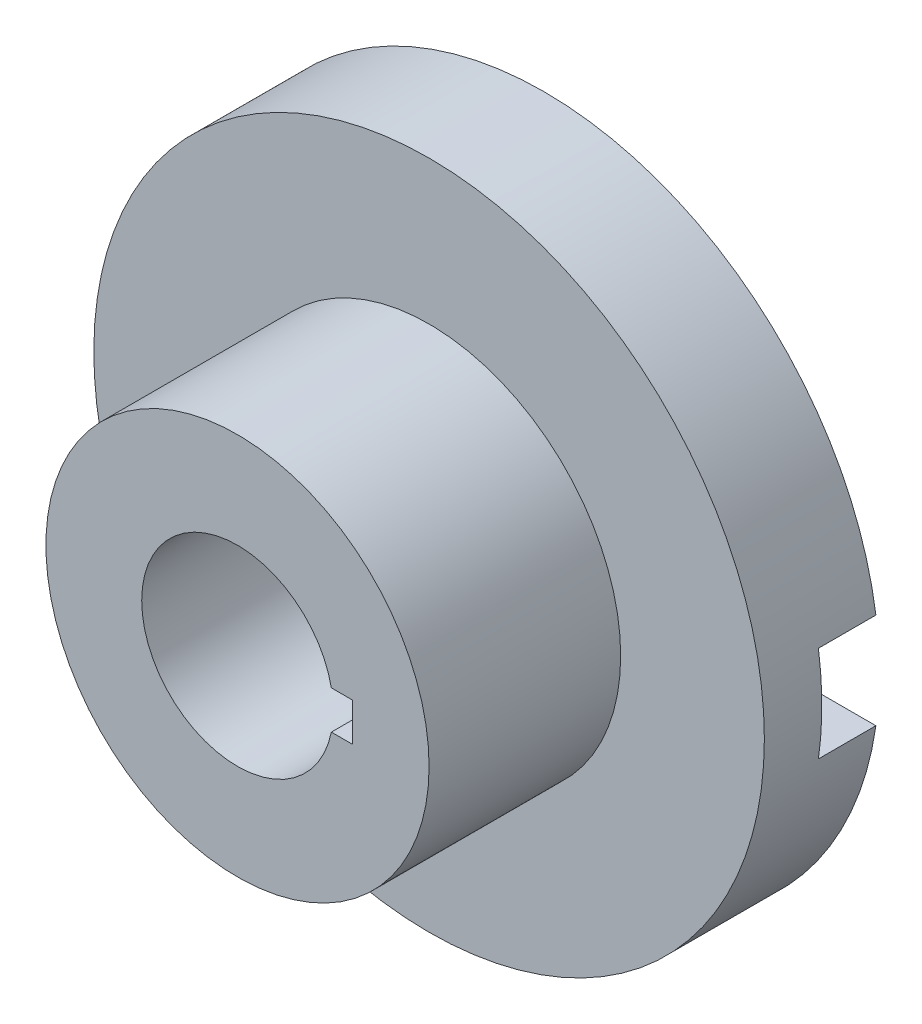
ISO-10303-21;
HEADER;
FILE_DESCRIPTION(('STEP AP214'),'2;1');
FILE_NAME('part.step','',(''),(''),'','','');
FILE_SCHEMA(('AUTOMOTIVE_DESIGN { 1 0 10303 214 1 1 1 1 }'));
ENDSEC;
DATA;
#1=APPLICATION_CONTEXT('core data for automotive mechanical design processes');
#2=APPLICATION_PROTOCOL_DEFINITION('international standard','automotive_design',2000,#1);
#3=PRODUCT_CONTEXT('',#1,'mechanical');
#4=PRODUCT('Part','Part','',(#3));
#5=PRODUCT_RELATED_PRODUCT_CATEGORY('part','',(#4));
#6=PRODUCT_DEFINITION_FORMATION('','',#4);
#7=PRODUCT_DEFINITION_CONTEXT('part definition',#1,'design');
#8=PRODUCT_DEFINITION('design','',#6,#7);
#9=PRODUCT_DEFINITION_SHAPE('','',#8);
#10=(LENGTH_UNIT() NAMED_UNIT(*) SI_UNIT(.MILLI.,.METRE.));
#11=(NAMED_UNIT(*) PLANE_ANGLE_UNIT() SI_UNIT($,.RADIAN.));
#12=(NAMED_UNIT(*) SI_UNIT($,.STERADIAN.) SOLID_ANGLE_UNIT());
#13=UNCERTAINTY_MEASURE_WITH_UNIT(LENGTH_MEASURE(1.E-05),#10,'distance_accuracy_value','');
#14=(GEOMETRIC_REPRESENTATION_CONTEXT(3) GLOBAL_UNCERTAINTY_ASSIGNED_CONTEXT((#13)) GLOBAL_UNIT_ASSIGNED_CONTEXT((#10,
#11,#12)) REPRESENTATION_CONTEXT('',''));
#15=CARTESIAN_POINT('',(0.,0.,0.));
#16=DIRECTION('',(0.,0.,1.));
#17=DIRECTION('',(1.,0.,0.));
#18=AXIS2_PLACEMENT_3D('',#15,#16,#17);
#19=CARTESIAN_POINT('',(173.205080756889,25.,30.));
#20=DIRECTION('',(0.,-1.,0.));
#21=DIRECTION('',(1.,0.,0.));
#22=AXIS2_PLACEMENT_3D('',#19,#20,#21);
#23=PLANE('',#22);
#24=DIRECTION('',(0.,0.,1.));
#25=VECTOR('',#24,1.);
#26=CARTESIAN_POINT('',(43.3012701892223,25.,0.));
#27=LINE('',#26,#25);
#28=CARTESIAN_POINT('',(43.3012701892223,25.,0.));
#29=VERTEX_POINT('',#28);
#30=CARTESIAN_POINT('',(43.3012701892223,25.,30.));
#31=VERTEX_POINT('',#30);
#32=EDGE_CURVE('E177',#29,#31,#27,.T.);
#33=ORIENTED_EDGE('',*,*,#32,.F.);
#34=DIRECTION('',(-1.,0.,0.));
#35=VECTOR('',#34,1.);
#36=CARTESIAN_POINT('',(173.205080756889,25.,0.));
#37=LINE('',#36,#35);
#38=CARTESIAN_POINT('',(173.205080756889,25.,0.));
#39=VERTEX_POINT('',#38);
#40=EDGE_CURVE('E207',#39,#29,#37,.T.);
#41=ORIENTED_EDGE('',*,*,#40,.F.);
#42=DIRECTION('',(0.,0.,-1.));
#43=VECTOR('',#42,1.);
#44=CARTESIAN_POINT('',(173.205080756889,25.,30.));
#45=LINE('',#44,#43);
#46=CARTESIAN_POINT('',(173.205080756889,25.,30.));
#47=VERTEX_POINT('',#46);
#48=EDGE_CURVE('E230',#47,#39,#45,.T.);
#49=ORIENTED_EDGE('',*,*,#48,.F.);
#50=DIRECTION('',(-1.,0.,0.));
#51=VECTOR('',#50,1.);
#52=CARTESIAN_POINT('',(173.205080756889,25.,30.));
#53=LINE('',#52,#51);
#54=EDGE_CURVE('E191',#47,#31,#53,.T.);
#55=ORIENTED_EDGE('',*,*,#54,.T.);
#56=EDGE_LOOP('',(#33,#41,#49,#55));
#57=FACE_BOUND('',#56,.T.);
#58=ADVANCED_FACE('F43',(#57),#23,.T.);
#59=CARTESIAN_POINT('',(173.205080756889,-25.,30.));
#60=DIRECTION('',(0.,-1.,0.));
#61=DIRECTION('',(1.,0.,0.));
#62=AXIS2_PLACEMENT_3D('',#59,#60,#61);
#63=PLANE('',#62);
#64=DIRECTION('',(-1.,0.,0.));
#65=VECTOR('',#64,1.);
#66=CARTESIAN_POINT('',(173.205080756889,-25.,0.));
#67=LINE('',#66,#65);
#68=CARTESIAN_POINT('',(173.205080756889,-25.,0.));
#69=VERTEX_POINT('',#68);
#70=CARTESIAN_POINT('',(43.3012701892223,-25.,0.));
#71=VERTEX_POINT('',#70);
#72=EDGE_CURVE('E195',#69,#71,#67,.T.);
#73=ORIENTED_EDGE('',*,*,#72,.T.);
#74=DIRECTION('',(0.,0.,1.));
#75=VECTOR('',#74,1.);
#76=CARTESIAN_POINT('',(43.3012701892223,-25.,0.));
#77=LINE('',#76,#75);
#78=CARTESIAN_POINT('',(43.3012701892223,-25.,30.));
#79=VERTEX_POINT('',#78);
#80=EDGE_CURVE('E166',#71,#79,#77,.T.);
#81=ORIENTED_EDGE('',*,*,#80,.T.);
#82=DIRECTION('',(-1.,0.,0.));
#83=VECTOR('',#82,1.);
#84=CARTESIAN_POINT('',(173.205080756889,-25.,30.));
#85=LINE('',#84,#83);
#86=CARTESIAN_POINT('',(173.205080756889,-25.,30.));
#87=VERTEX_POINT('',#86);
#88=EDGE_CURVE('E204',#87,#79,#85,.T.);
#89=ORIENTED_EDGE('',*,*,#88,.F.);
#90=DIRECTION('',(0.,0.,-1.));
#91=VECTOR('',#90,1.);
#92=CARTESIAN_POINT('',(173.205080756889,-25.,30.));
#93=LINE('',#92,#91);
#94=EDGE_CURVE('E208',#87,#69,#93,.T.);
#95=ORIENTED_EDGE('',*,*,#94,.T.);
#96=EDGE_LOOP('',(#73,#81,#89,#95));
#97=FACE_BOUND('',#96,.T.);
#98=ADVANCED_FACE('F320',(#97),#63,.F.);
#99=CARTESIAN_POINT('',(0.,0.,30.));
#100=DIRECTION('',(0.,0.,1.));
#101=DIRECTION('',(1.,0.,0.));
#102=AXIS2_PLACEMENT_3D('',#99,#100,#101);
#103=PLANE('',#102);
#104=CARTESIAN_POINT('',(-43.3012701892219,24.9999999999999,30.));
#105=VERTEX_POINT('',#104);
#106=CARTESIAN_POINT('',(-173.205080756888,24.9999999999999,30.));
#107=VERTEX_POINT('',#106);
#108=EDGE_CURVE('E192',#105,#107,#53,.T.);
#109=ORIENTED_EDGE('',*,*,#108,.F.);
#110=CARTESIAN_POINT('',(0.,0.,30.));
#111=DIRECTION('',(0.,0.,1.));
#112=DIRECTION('',(1.,0.,0.));
#113=AXIS2_PLACEMENT_3D('',#110,#111,#112);
#114=CIRCLE('',#113,50.);
#115=CARTESIAN_POINT('',(-43.3012701892219,-25.,30.));
#116=VERTEX_POINT('',#115);
#117=EDGE_CURVE('E11',#105,#116,#114,.T.);
#118=ORIENTED_EDGE('',*,*,#117,.T.);
#119=CARTESIAN_POINT('',(-173.205080756888,-25.,30.));
#120=VERTEX_POINT('',#119);
#121=EDGE_CURVE('E201',#116,#120,#85,.T.);
#122=ORIENTED_EDGE('',*,*,#121,.T.);
#123=CARTESIAN_POINT('',(0.,0.,30.));
#124=DIRECTION('',(0.,0.,1.));
#125=DIRECTION('',(1.,0.,0.));
#126=AXIS2_PLACEMENT_3D('',#123,#124,#125);
#127=CIRCLE('',#126,175.);
#128=EDGE_CURVE('E200',#107,#120,#127,.T.);
#129=ORIENTED_EDGE('',*,*,#128,.F.);
#130=EDGE_LOOP('',(#109,#118,#122,#129));
#131=FACE_BOUND('',#130,.T.);
#132=ADVANCED_FACE('F281',(#131),#103,.F.);
#133=CARTESIAN_POINT('',(0.,0.,0.));
#134=DIRECTION('',(0.,0.,1.));
#135=DIRECTION('',(1.,0.,0.));
#136=AXIS2_PLACEMENT_3D('',#133,#134,#135);
#137=PLANE('',#136);
#138=CARTESIAN_POINT('',(-43.3012701892219,-25.,0.));
#139=VERTEX_POINT('',#138);
#140=CARTESIAN_POINT('',(-173.205080756888,-25.,0.));
#141=VERTEX_POINT('',#140);
#142=EDGE_CURVE('E213',#139,#141,#67,.T.);
#143=ORIENTED_EDGE('',*,*,#142,.F.);
#144=CARTESIAN_POINT('',(0.,0.,0.));
#145=DIRECTION('',(0.,0.,1.));
#146=DIRECTION('',(1.,0.,0.));
#147=AXIS2_PLACEMENT_3D('',#144,#145,#146);
#148=CIRCLE('',#147,50.);
#149=EDGE_CURVE('E165',#139,#71,#148,.T.);
#150=ORIENTED_EDGE('',*,*,#149,.T.);
#151=ORIENTED_EDGE('',*,*,#72,.F.);
#152=CARTESIAN_POINT('',(0.,0.,0.));
#153=DIRECTION('',(0.,0.,1.));
#154=DIRECTION('',(1.,0.,0.));
#155=AXIS2_PLACEMENT_3D('',#152,#153,#154);
#156=CIRCLE('',#155,175.);
#157=EDGE_CURVE('E231',#141,#69,#156,.T.);
#158=ORIENTED_EDGE('',*,*,#157,.F.);
#159=EDGE_LOOP('',(#143,#150,#151,#158));
#160=FACE_BOUND('',#159,.T.);
#161=ADVANCED_FACE('F312',(#160),#137,.F.);
#162=CARTESIAN_POINT('',(0.,0.,60.0000000000001));
#163=DIRECTION('',(0.,0.,-1.));
#164=DIRECTION('',(-1.,0.,0.));
#165=AXIS2_PLACEMENT_3D('',#162,#163,#164);
#166=CYLINDRICAL_SURFACE('',#165,175.);
#167=CARTESIAN_POINT('',(0.,0.,30.));
#168=DIRECTION('',(0.,0.,1.));
#169=DIRECTION('',(1.,0.,0.));
#170=AXIS2_PLACEMENT_3D('',#167,#168,#169);
#171=CIRCLE('',#170,175.);
#172=EDGE_CURVE('E186',#87,#47,#171,.T.);
#173=ORIENTED_EDGE('',*,*,#172,.T.);
#174=ORIENTED_EDGE('',*,*,#48,.T.);
#175=CARTESIAN_POINT('',(-173.205080756888,24.9999999999999,0.));
#176=VERTEX_POINT('',#175);
#177=EDGE_CURVE('E241',#39,#176,#156,.T.);
#178=ORIENTED_EDGE('',*,*,#177,.T.);
#179=DIRECTION('',(0.,0.,-1.));
#180=VECTOR('',#179,1.);
#181=CARTESIAN_POINT('',(-173.205080756888,24.9999999999999,30.));
#182=LINE('',#181,#180);
#183=EDGE_CURVE('E224',#107,#176,#182,.T.);
#184=ORIENTED_EDGE('',*,*,#183,.F.);
#185=ORIENTED_EDGE('',*,*,#128,.T.);
#186=DIRECTION('',(0.,0.,-1.));
#187=VECTOR('',#186,1.);
#188=CARTESIAN_POINT('',(-173.205080756888,-25.,30.));
#189=LINE('',#188,#187);
#190=EDGE_CURVE('E218',#120,#141,#189,.T.);
#191=ORIENTED_EDGE('',*,*,#190,.T.);
#192=ORIENTED_EDGE('',*,*,#157,.T.);
#193=ORIENTED_EDGE('',*,*,#94,.F.);
#194=EDGE_LOOP('',(#173,#174,#178,#184,#185,#191,#192,#193));
#195=FACE_BOUND('',#194,.T.);
#196=CARTESIAN_POINT('',(0.,0.,60.0000000000001));
#197=DIRECTION('',(0.,0.,1.));
#198=DIRECTION('',(1.,0.,0.));
#199=AXIS2_PLACEMENT_3D('',#196,#197,#198);
#200=CIRCLE('',#199,175.);
#201=CARTESIAN_POINT('',(175.,0.,60.0000000000001));
#202=VERTEX_POINT('',#201);
#203=EDGE_CURVE('E238',#202,#202,#200,.T.);
#204=ORIENTED_EDGE('',*,*,#203,.F.);
#205=EDGE_LOOP('',(#204));
#206=FACE_BOUND('',#205,.T.);
#207=ADVANCED_FACE('F44',(#195,#206),#166,.T.);
#208=CARTESIAN_POINT('',(0.,0.,60.0000000000001));
#209=DIRECTION('',(0.,0.,1.));
#210=DIRECTION('',(1.,0.,0.));
#211=AXIS2_PLACEMENT_3D('',#208,#209,#210);
#212=PLANE('',#211);
#213=CARTESIAN_POINT('',(0.,0.,60.0000000000001));
#214=DIRECTION('',(0.,0.,1.));
#215=DIRECTION('',(1.,0.,0.));
#216=AXIS2_PLACEMENT_3D('',#213,#214,#215);
#217=CIRCLE('',#216,100.);
#218=CARTESIAN_POINT('',(100.,0.,60.0000000000001));
#219=VERTEX_POINT('',#218);
#220=EDGE_CURVE('E237',#219,#219,#217,.T.);
#221=ORIENTED_EDGE('',*,*,#220,.F.);
#222=EDGE_LOOP('',(#221));
#223=FACE_BOUND('',#222,.T.);
#224=ORIENTED_EDGE('',*,*,#203,.T.);
#225=EDGE_LOOP('',(#224));
#226=FACE_BOUND('',#225,.T.);
#227=ADVANCED_FACE('F363',(#223,#226),#212,.T.);
#228=ORIENTED_EDGE('',*,*,#40,.T.);
#229=CARTESIAN_POINT('',(-43.3012701892219,24.9999999999999,0.));
#230=VERTEX_POINT('',#229);
#231=EDGE_CURVE('E171',#29,#230,#148,.T.);
#232=ORIENTED_EDGE('',*,*,#231,.T.);
#233=EDGE_CURVE('E189',#230,#176,#37,.T.);
#234=ORIENTED_EDGE('',*,*,#233,.T.);
#235=ORIENTED_EDGE('',*,*,#177,.F.);
#236=EDGE_LOOP('',(#228,#232,#234,#235));
#237=FACE_BOUND('',#236,.T.);
#238=ADVANCED_FACE('F271',(#237),#137,.F.);
#239=CARTESIAN_POINT('',(0.,0.,160.));
#240=DIRECTION('',(0.,0.,-1.));
#241=DIRECTION('',(-1.,0.,0.));
#242=AXIS2_PLACEMENT_3D('',#239,#240,#241);
#243=CYLINDRICAL_SURFACE('',#242,100.);
#244=CARTESIAN_POINT('',(0.,0.,160.));
#245=DIRECTION('',(0.,0.,1.));
#246=DIRECTION('',(1.,0.,0.));
#247=AXIS2_PLACEMENT_3D('',#244,#245,#246);
#248=CIRCLE('',#247,100.);
#249=CARTESIAN_POINT('',(100.,0.,160.));
#250=VERTEX_POINT('',#249);
#251=EDGE_CURVE('E233',#250,#250,#248,.T.);
#252=ORIENTED_EDGE('',*,*,#251,.F.);
#253=EDGE_LOOP('',(#252));
#254=FACE_BOUND('',#253,.T.);
#255=ORIENTED_EDGE('',*,*,#220,.T.);
#256=EDGE_LOOP('',(#255));
#257=FACE_BOUND('',#256,.T.);
#258=ADVANCED_FACE('F353',(#254,#257),#243,.T.);
#259=CARTESIAN_POINT('',(0.,0.,160.));
#260=DIRECTION('',(0.,0.,1.));
#261=DIRECTION('',(1.,0.,0.));
#262=AXIS2_PLACEMENT_3D('',#259,#260,#261);
#263=PLANE('',#262);
#264=DIRECTION('',(-1.,0.,0.));
#265=VECTOR('',#264,1.);
#266=CARTESIAN_POINT('',(59.9997948556635,10.,160.));
#267=LINE('',#266,#265);
#268=CARTESIAN_POINT('',(59.9997948556635,10.,160.));
#269=VERTEX_POINT('',#268);
#270=CARTESIAN_POINT('',(48.9897948556638,10.,160.));
#271=VERTEX_POINT('',#270);
#272=EDGE_CURVE('E65',#269,#271,#267,.T.);
#273=ORIENTED_EDGE('',*,*,#272,.F.);
#274=DIRECTION('',(0.,1.,0.));
#275=VECTOR('',#274,1.);
#276=CARTESIAN_POINT('',(59.9997948556635,10.,160.));
#277=LINE('',#276,#275);
#278=CARTESIAN_POINT('',(59.9997948556635,-10.,160.));
#279=VERTEX_POINT('',#278);
#280=EDGE_CURVE('E160',#279,#269,#277,.T.);
#281=ORIENTED_EDGE('',*,*,#280,.F.);
#282=DIRECTION('',(1.,0.,0.));
#283=VECTOR('',#282,1.);
#284=CARTESIAN_POINT('',(59.9997948556635,-10.,160.));
#285=LINE('',#284,#283);
#286=CARTESIAN_POINT('',(48.9897948556638,-10.,160.));
#287=VERTEX_POINT('',#286);
#288=EDGE_CURVE('E140',#287,#279,#285,.T.);
#289=ORIENTED_EDGE('',*,*,#288,.F.);
#290=CARTESIAN_POINT('',(0.,0.,160.));
#291=DIRECTION('',(0.,0.,1.));
#292=DIRECTION('',(1.,0.,0.));
#293=AXIS2_PLACEMENT_3D('',#290,#291,#292);
#294=CIRCLE('',#293,50.);
#295=EDGE_CURVE('E149',#271,#287,#294,.T.);
#296=ORIENTED_EDGE('',*,*,#295,.F.);
#297=EDGE_LOOP('',(#273,#281,#289,#296));
#298=FACE_BOUND('',#297,.T.);
#299=ORIENTED_EDGE('',*,*,#251,.T.);
#300=EDGE_LOOP('',(#299));
#301=FACE_BOUND('',#300,.T.);
#302=ADVANCED_FACE('F152',(#298,#301),#263,.T.);
#303=DIRECTION('',(0.,0.,1.));
#304=VECTOR('',#303,1.);
#305=CARTESIAN_POINT('',(-43.3012701892219,24.9999999999999,0.));
#306=LINE('',#305,#304);
#307=EDGE_CURVE('E183',#105,#230,#306,.F.);
#308=ORIENTED_EDGE('',*,*,#307,.F.);
#309=ORIENTED_EDGE('',*,*,#108,.T.);
#310=ORIENTED_EDGE('',*,*,#183,.T.);
#311=ORIENTED_EDGE('',*,*,#233,.F.);
#312=EDGE_LOOP('',(#308,#309,#310,#311));
#313=FACE_BOUND('',#312,.T.);
#314=ADVANCED_FACE('F280',(#313),#23,.T.);
#315=ORIENTED_EDGE('',*,*,#121,.F.);
#316=DIRECTION('',(0.,0.,1.));
#317=VECTOR('',#316,1.);
#318=CARTESIAN_POINT('',(-43.3012701892219,-25.,0.));
#319=LINE('',#318,#317);
#320=EDGE_CURVE('E182',#116,#139,#319,.F.);
#321=ORIENTED_EDGE('',*,*,#320,.T.);
#322=ORIENTED_EDGE('',*,*,#142,.T.);
#323=ORIENTED_EDGE('',*,*,#190,.F.);
#324=EDGE_LOOP('',(#315,#321,#322,#323));
#325=FACE_BOUND('',#324,.T.);
#326=ADVANCED_FACE('F287',(#325),#63,.F.);
#327=DIRECTION('',(-1.,0.,0.));
#328=VECTOR('',#327,1.);
#329=CARTESIAN_POINT('',(0.,10.,30.));
#330=LINE('',#329,#328);
#331=CARTESIAN_POINT('',(59.9997948556635,10.,30.));
#332=VERTEX_POINT('',#331);
#333=CARTESIAN_POINT('',(48.9897948556638,10.,30.));
#334=VERTEX_POINT('',#333);
#335=EDGE_CURVE('E50',#332,#334,#330,.T.);
#336=ORIENTED_EDGE('',*,*,#335,.T.);
#337=EDGE_CURVE('E52',#334,#31,#114,.T.);
#338=ORIENTED_EDGE('',*,*,#337,.T.);
#339=ORIENTED_EDGE('',*,*,#54,.F.);
#340=ORIENTED_EDGE('',*,*,#172,.F.);
#341=ORIENTED_EDGE('',*,*,#88,.T.);
#342=CARTESIAN_POINT('',(48.9897948556638,-10.,30.));
#343=VERTEX_POINT('',#342);
#344=EDGE_CURVE('E54',#79,#343,#114,.T.);
#345=ORIENTED_EDGE('',*,*,#344,.T.);
#346=DIRECTION('',(1.,0.,0.));
#347=VECTOR('',#346,1.);
#348=CARTESIAN_POINT('',(0.,-10.,30.));
#349=LINE('',#348,#347);
#350=CARTESIAN_POINT('',(59.9997948556635,-10.,30.));
#351=VERTEX_POINT('',#350);
#352=EDGE_CURVE('E142',#343,#351,#349,.T.);
#353=ORIENTED_EDGE('',*,*,#352,.T.);
#354=DIRECTION('',(0.,1.,0.));
#355=VECTOR('',#354,1.);
#356=CARTESIAN_POINT('',(59.9997948556635,0.,30.));
#357=LINE('',#356,#355);
#358=EDGE_CURVE('E246',#351,#332,#357,.T.);
#359=ORIENTED_EDGE('',*,*,#358,.T.);
#360=EDGE_LOOP('',(#336,#338,#339,#340,#341,#345,#353,#359));
#361=FACE_BOUND('',#360,.T.);
#362=ADVANCED_FACE('F265',(#361),#103,.F.);
#363=CARTESIAN_POINT('',(59.9997948556635,10.,0.));
#364=DIRECTION('',(0.,1.,0.));
#365=DIRECTION('',(-1.,0.,0.));
#366=AXIS2_PLACEMENT_3D('',#363,#364,#365);
#367=PLANE('',#366);
#368=DIRECTION('',(0.,0.,1.));
#369=VECTOR('',#368,1.);
#370=CARTESIAN_POINT('',(59.9997948556635,10.,0.));
#371=LINE('',#370,#369);
#372=EDGE_CURVE('E167',#332,#269,#371,.T.);
#373=ORIENTED_EDGE('',*,*,#372,.T.);
#374=ORIENTED_EDGE('',*,*,#272,.T.);
#375=DIRECTION('',(0.,0.,1.));
#376=VECTOR('',#375,1.);
#377=CARTESIAN_POINT('',(48.9897948556638,10.,0.));
#378=LINE('',#377,#376);
#379=EDGE_CURVE('E148',#334,#271,#378,.T.);
#380=ORIENTED_EDGE('',*,*,#379,.F.);
#381=ORIENTED_EDGE('',*,*,#335,.F.);
#382=EDGE_LOOP('',(#373,#374,#380,#381));
#383=FACE_BOUND('',#382,.T.);
#384=ADVANCED_FACE('F352',(#383),#367,.F.);
#385=CARTESIAN_POINT('',(59.9997948556635,10.,0.));
#386=DIRECTION('',(1.,0.,0.));
#387=DIRECTION('',(0.,0.,-1.));
#388=AXIS2_PLACEMENT_3D('',#385,#386,#387);
#389=PLANE('',#388);
#390=DIRECTION('',(0.,0.,1.));
#391=VECTOR('',#390,1.);
#392=CARTESIAN_POINT('',(59.9997948556635,-10.,0.));
#393=LINE('',#392,#391);
#394=EDGE_CURVE('E144',#351,#279,#393,.T.);
#395=ORIENTED_EDGE('',*,*,#394,.T.);
#396=ORIENTED_EDGE('',*,*,#280,.T.);
#397=ORIENTED_EDGE('',*,*,#372,.F.);
#398=ORIENTED_EDGE('',*,*,#358,.F.);
#399=EDGE_LOOP('',(#395,#396,#397,#398));
#400=FACE_BOUND('',#399,.T.);
#401=ADVANCED_FACE('F436',(#400),#389,.F.);
#402=CARTESIAN_POINT('',(59.9997948556635,-10.,0.));
#403=DIRECTION('',(0.,-1.,0.));
#404=DIRECTION('',(0.,0.,-1.));
#405=AXIS2_PLACEMENT_3D('',#402,#403,#404);
#406=PLANE('',#405);
#407=DIRECTION('',(0.,0.,1.));
#408=VECTOR('',#407,1.);
#409=CARTESIAN_POINT('',(48.9897948556638,-10.,0.));
#410=LINE('',#409,#408);
#411=EDGE_CURVE('E66',#343,#287,#410,.T.);
#412=ORIENTED_EDGE('',*,*,#411,.T.);
#413=ORIENTED_EDGE('',*,*,#288,.T.);
#414=ORIENTED_EDGE('',*,*,#394,.F.);
#415=ORIENTED_EDGE('',*,*,#352,.F.);
#416=EDGE_LOOP('',(#412,#413,#414,#415));
#417=FACE_BOUND('',#416,.T.);
#418=ADVANCED_FACE('F138',(#417),#406,.F.);
#419=CARTESIAN_POINT('',(0.,0.,0.));
#420=DIRECTION('',(0.,0.,1.));
#421=DIRECTION('',(1.,0.,0.));
#422=AXIS2_PLACEMENT_3D('',#419,#420,#421);
#423=CYLINDRICAL_SURFACE('',#422,50.);
#424=ORIENTED_EDGE('',*,*,#307,.T.);
#425=ORIENTED_EDGE('',*,*,#231,.F.);
#426=ORIENTED_EDGE('',*,*,#32,.T.);
#427=ORIENTED_EDGE('',*,*,#337,.F.);
#428=ORIENTED_EDGE('',*,*,#379,.T.);
#429=ORIENTED_EDGE('',*,*,#295,.T.);
#430=ORIENTED_EDGE('',*,*,#411,.F.);
#431=ORIENTED_EDGE('',*,*,#344,.F.);
#432=ORIENTED_EDGE('',*,*,#80,.F.);
#433=ORIENTED_EDGE('',*,*,#149,.F.);
#434=ORIENTED_EDGE('',*,*,#320,.F.);
#435=ORIENTED_EDGE('',*,*,#117,.F.);
#436=EDGE_LOOP('',(#424,#425,#426,#427,#428,#429,#430,#431,#432,#433,#434,#435));
#437=FACE_BOUND('',#436,.T.);
#438=ADVANCED_FACE('F147',(#437),#423,.F.);
#439=CLOSED_SHELL('',(#58,#98,#132,#161,#207,#227,#238,#258,#302,#314,#326,#362,#384,#401,#418,#438));
#440=MANIFOLD_SOLID_BREP('B2',#439);
#441=ADVANCED_BREP_SHAPE_REPRESENTATION('',(#18,#440),#14);
#442=SHAPE_DEFINITION_REPRESENTATION(#9,#441);
ENDSEC;
END-ISO-10303-21;
